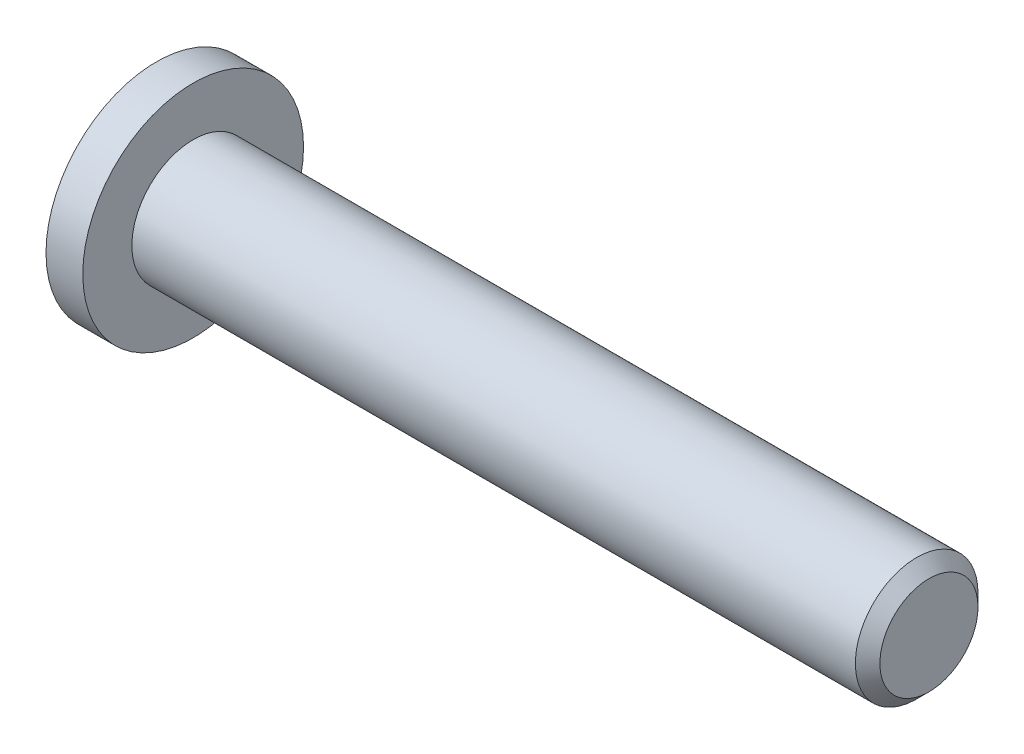
ISO-10303-21;
HEADER;
FILE_DESCRIPTION(('STEP AP214'),'2;1');
FILE_NAME('part.step','',(''),(''),'','','');
FILE_SCHEMA(('AUTOMOTIVE_DESIGN { 1 0 10303 214 1 1 1 1 }'));
ENDSEC;
DATA;
#1=APPLICATION_CONTEXT('core data for automotive mechanical design processes');
#2=APPLICATION_PROTOCOL_DEFINITION('international standard','automotive_design',2000,#1);
#3=PRODUCT_CONTEXT('',#1,'mechanical');
#4=PRODUCT('Part','Part','',(#3));
#5=PRODUCT_RELATED_PRODUCT_CATEGORY('part','',(#4));
#6=PRODUCT_DEFINITION_FORMATION('','',#4);
#7=PRODUCT_DEFINITION_CONTEXT('part definition',#1,'design');
#8=PRODUCT_DEFINITION('design','',#6,#7);
#9=PRODUCT_DEFINITION_SHAPE('','',#8);
#10=(LENGTH_UNIT() NAMED_UNIT(*) SI_UNIT(.MILLI.,.METRE.));
#11=(NAMED_UNIT(*) PLANE_ANGLE_UNIT() SI_UNIT($,.RADIAN.));
#12=(NAMED_UNIT(*) SI_UNIT($,.STERADIAN.) SOLID_ANGLE_UNIT());
#13=UNCERTAINTY_MEASURE_WITH_UNIT(LENGTH_MEASURE(1.E-05),#10,'distance_accuracy_value','');
#14=(GEOMETRIC_REPRESENTATION_CONTEXT(3) GLOBAL_UNCERTAINTY_ASSIGNED_CONTEXT((#13)) GLOBAL_UNIT_ASSIGNED_CONTEXT((#10,
#11,#12)) REPRESENTATION_CONTEXT('',''));
#15=CARTESIAN_POINT('',(0.,0.,0.));
#16=DIRECTION('',(0.,0.,1.));
#17=DIRECTION('',(1.,0.,0.));
#18=AXIS2_PLACEMENT_3D('',#15,#16,#17);
#19=CARTESIAN_POINT('',(1.5,0.,0.));
#20=DIRECTION('',(-1.,0.,0.));
#21=DIRECTION('',(0.,0.,1.));
#22=AXIS2_PLACEMENT_3D('',#19,#20,#21);
#23=CYLINDRICAL_SURFACE('',#22,4.5);
#24=CARTESIAN_POINT('',(1.5,0.,0.));
#25=DIRECTION('',(1.,0.,0.));
#26=DIRECTION('',(0.,0.,-1.));
#27=AXIS2_PLACEMENT_3D('',#24,#25,#26);
#28=CIRCLE('',#27,4.5);
#29=CARTESIAN_POINT('',(1.5,0.,-4.5));
#30=VERTEX_POINT('',#29);
#31=EDGE_CURVE('E151',#30,#30,#28,.T.);
#32=ORIENTED_EDGE('',*,*,#31,.F.);
#33=EDGE_LOOP('',(#32));
#34=FACE_BOUND('',#33,.T.);
#35=CARTESIAN_POINT('',(0.,0.,0.));
#36=DIRECTION('',(1.,0.,0.));
#37=DIRECTION('',(0.,0.,-1.));
#38=AXIS2_PLACEMENT_3D('',#35,#36,#37);
#39=CIRCLE('',#38,4.5);
#40=CARTESIAN_POINT('',(0.,0.,-4.5));
#41=VERTEX_POINT('',#40);
#42=EDGE_CURVE('E150',#41,#41,#39,.T.);
#43=ORIENTED_EDGE('',*,*,#42,.T.);
#44=EDGE_LOOP('',(#43));
#45=FACE_BOUND('',#44,.T.);
#46=ADVANCED_FACE('F40',(#34,#45),#23,.T.);
#47=CARTESIAN_POINT('',(1.5,0.,0.));
#48=DIRECTION('',(1.,0.,0.));
#49=DIRECTION('',(0.,0.,-1.));
#50=AXIS2_PLACEMENT_3D('',#47,#48,#49);
#51=PLANE('',#50);
#52=CARTESIAN_POINT('',(1.5,0.,0.));
#53=DIRECTION('',(1.,0.,0.));
#54=DIRECTION('',(0.,0.,-1.));
#55=AXIS2_PLACEMENT_3D('',#52,#53,#54);
#56=CIRCLE('',#55,2.5);
#57=CARTESIAN_POINT('',(1.5,0.,-2.5));
#58=VERTEX_POINT('',#57);
#59=EDGE_CURVE('E142',#58,#58,#56,.T.);
#60=ORIENTED_EDGE('',*,*,#59,.F.);
#61=EDGE_LOOP('',(#60));
#62=FACE_BOUND('',#61,.T.);
#63=ORIENTED_EDGE('',*,*,#31,.T.);
#64=EDGE_LOOP('',(#63));
#65=FACE_BOUND('',#64,.T.);
#66=ADVANCED_FACE('F169',(#62,#65),#51,.T.);
#67=CARTESIAN_POINT('',(0.,0.,0.));
#68=DIRECTION('',(1.,0.,0.));
#69=DIRECTION('',(0.,0.,-1.));
#70=AXIS2_PLACEMENT_3D('',#67,#68,#69);
#71=PLANE('',#70);
#72=DIRECTION('',(0.,-0.500000000000001,-0.866025403784439));
#73=VECTOR('',#72,1.);
#74=CARTESIAN_POINT('',(0.,1.73205080756887,0.));
#75=LINE('',#74,#73);
#76=CARTESIAN_POINT('',(0.,1.73205080756887,0.));
#77=VERTEX_POINT('',#76);
#78=CARTESIAN_POINT('',(0.,0.866025403784415,-1.49999999999999));
#79=VERTEX_POINT('',#78);
#80=EDGE_CURVE('E129',#77,#79,#75,.T.);
#81=ORIENTED_EDGE('',*,*,#80,.F.);
#82=DIRECTION('',(0.,0.5,-0.866025403784438));
#83=VECTOR('',#82,1.);
#84=CARTESIAN_POINT('',(0.,0.866025403784429,1.50000000000001));
#85=LINE('',#84,#83);
#86=CARTESIAN_POINT('',(0.,0.866025403784429,1.50000000000001));
#87=VERTEX_POINT('',#86);
#88=EDGE_CURVE('E55',#87,#77,#85,.T.);
#89=ORIENTED_EDGE('',*,*,#88,.F.);
#90=DIRECTION('',(0.,1.,0.));
#91=VECTOR('',#90,1.);
#92=CARTESIAN_POINT('',(0.,-0.866025403784457,1.5));
#93=LINE('',#92,#91);
#94=CARTESIAN_POINT('',(0.,-0.866025403784457,1.5));
#95=VERTEX_POINT('',#94);
#96=EDGE_CURVE('E138',#95,#87,#93,.T.);
#97=ORIENTED_EDGE('',*,*,#96,.F.);
#98=DIRECTION('',(0.,0.500000000000001,0.866025403784439));
#99=VECTOR('',#98,1.);
#100=CARTESIAN_POINT('',(0.,-1.73205080756891,0.));
#101=LINE('',#100,#99);
#102=CARTESIAN_POINT('',(0.,-1.73205080756891,0.));
#103=VERTEX_POINT('',#102);
#104=EDGE_CURVE('E136',#103,#95,#101,.T.);
#105=ORIENTED_EDGE('',*,*,#104,.F.);
#106=DIRECTION('',(0.,-0.500000000000001,0.866025403784438));
#107=VECTOR('',#106,1.);
#108=CARTESIAN_POINT('',(0.,-0.866025403784443,-1.49999999999999));
#109=LINE('',#108,#107);
#110=CARTESIAN_POINT('',(0.,-0.866025403784443,-1.49999999999999));
#111=VERTEX_POINT('',#110);
#112=EDGE_CURVE('E103',#111,#103,#109,.T.);
#113=ORIENTED_EDGE('',*,*,#112,.F.);
#114=DIRECTION('',(0.,-1.,0.));
#115=VECTOR('',#114,1.);
#116=CARTESIAN_POINT('',(0.,0.866025403784415,-1.49999999999999));
#117=LINE('',#116,#115);
#118=EDGE_CURVE('E132',#79,#111,#117,.T.);
#119=ORIENTED_EDGE('',*,*,#118,.F.);
#120=EDGE_LOOP('',(#81,#89,#97,#105,#113,#119));
#121=FACE_BOUND('',#120,.T.);
#122=ORIENTED_EDGE('',*,*,#42,.F.);
#123=EDGE_LOOP('',(#122));
#124=FACE_BOUND('',#123,.T.);
#125=ADVANCED_FACE('F174',(#121,#124),#71,.F.);
#126=CARTESIAN_POINT('',(31.5,0.,0.));
#127=DIRECTION('',(-1.,0.,0.));
#128=DIRECTION('',(0.,0.,1.));
#129=AXIS2_PLACEMENT_3D('',#126,#127,#128);
#130=CYLINDRICAL_SURFACE('',#129,2.5);
#131=CARTESIAN_POINT('',(31.,0.,0.));
#132=DIRECTION('',(1.,0.,0.));
#133=DIRECTION('',(0.,0.,-1.));
#134=AXIS2_PLACEMENT_3D('',#131,#132,#133);
#135=CIRCLE('',#134,2.5);
#136=CARTESIAN_POINT('',(31.,0.,-2.50000000000001));
#137=VERTEX_POINT('',#136);
#138=EDGE_CURVE('E11',#137,#137,#135,.F.);
#139=ORIENTED_EDGE('',*,*,#138,.T.);
#140=EDGE_LOOP('',(#139));
#141=FACE_BOUND('',#140,.T.);
#142=ORIENTED_EDGE('',*,*,#59,.T.);
#143=EDGE_LOOP('',(#142));
#144=FACE_BOUND('',#143,.T.);
#145=ADVANCED_FACE('F181',(#141,#144),#130,.T.);
#146=CARTESIAN_POINT('',(31.5,0.,0.));
#147=DIRECTION('',(1.,0.,0.));
#148=DIRECTION('',(0.,0.,-1.));
#149=AXIS2_PLACEMENT_3D('',#146,#147,#148);
#150=PLANE('',#149);
#151=CARTESIAN_POINT('',(31.5,0.,0.));
#152=DIRECTION('',(1.,0.,0.));
#153=DIRECTION('',(0.,0.,-1.));
#154=AXIS2_PLACEMENT_3D('',#151,#152,#153);
#155=CIRCLE('',#154,2.);
#156=CARTESIAN_POINT('',(31.5,0.,-2.00000000000001));
#157=VERTEX_POINT('',#156);
#158=EDGE_CURVE('E48',#157,#157,#155,.T.);
#159=ORIENTED_EDGE('',*,*,#158,.T.);
#160=EDGE_LOOP('',(#159));
#161=FACE_BOUND('',#160,.T.);
#162=ADVANCED_FACE('F158',(#161),#150,.T.);
#163=CARTESIAN_POINT('',(3.,0.866025403784429,1.50000000000002));
#164=DIRECTION('',(0.,0.866025403784441,0.5));
#165=DIRECTION('',(0.,-0.5,0.866025403784439));
#166=AXIS2_PLACEMENT_3D('',#163,#164,#165);
#167=PLANE('',#166);
#168=ORIENTED_EDGE('',*,*,#88,.T.);
#169=DIRECTION('',(-1.,0.,0.));
#170=VECTOR('',#169,1.);
#171=CARTESIAN_POINT('',(3.,1.73205080756887,0.));
#172=LINE('',#171,#170);
#173=CARTESIAN_POINT('',(3.,1.73205080756887,0.));
#174=VERTEX_POINT('',#173);
#175=EDGE_CURVE('E85',#174,#77,#172,.T.);
#176=ORIENTED_EDGE('',*,*,#175,.F.);
#177=DIRECTION('',(0.,0.5,-0.866025403784438));
#178=VECTOR('',#177,1.);
#179=CARTESIAN_POINT('',(3.,0.866025403784429,1.50000000000002));
#180=LINE('',#179,#178);
#181=CARTESIAN_POINT('',(3.,0.866025403784429,1.50000000000002));
#182=VERTEX_POINT('',#181);
#183=EDGE_CURVE('E140',#182,#174,#180,.T.);
#184=ORIENTED_EDGE('',*,*,#183,.F.);
#185=DIRECTION('',(-1.,0.,0.));
#186=VECTOR('',#185,1.);
#187=CARTESIAN_POINT('',(3.,0.866025403784429,1.50000000000002));
#188=LINE('',#187,#186);
#189=EDGE_CURVE('E63',#182,#87,#188,.T.);
#190=ORIENTED_EDGE('',*,*,#189,.T.);
#191=EDGE_LOOP('',(#168,#176,#184,#190));
#192=FACE_BOUND('',#191,.T.);
#193=ADVANCED_FACE('F189',(#192),#167,.F.);
#194=CARTESIAN_POINT('',(3.,-0.866025403784457,1.5));
#195=DIRECTION('',(0.,0.,1.));
#196=DIRECTION('',(0.,-1.,0.));
#197=AXIS2_PLACEMENT_3D('',#194,#195,#196);
#198=PLANE('',#197);
#199=ORIENTED_EDGE('',*,*,#96,.T.);
#200=ORIENTED_EDGE('',*,*,#189,.F.);
#201=DIRECTION('',(0.,1.,0.));
#202=VECTOR('',#201,1.);
#203=CARTESIAN_POINT('',(3.,-0.866025403784457,1.5));
#204=LINE('',#203,#202);
#205=CARTESIAN_POINT('',(3.,-0.866025403784457,1.5));
#206=VERTEX_POINT('',#205);
#207=EDGE_CURVE('E115',#206,#182,#204,.T.);
#208=ORIENTED_EDGE('',*,*,#207,.F.);
#209=DIRECTION('',(-1.,0.,0.));
#210=VECTOR('',#209,1.);
#211=CARTESIAN_POINT('',(3.,-0.866025403784457,1.5));
#212=LINE('',#211,#210);
#213=EDGE_CURVE('E107',#206,#95,#212,.T.);
#214=ORIENTED_EDGE('',*,*,#213,.T.);
#215=EDGE_LOOP('',(#199,#200,#208,#214));
#216=FACE_BOUND('',#215,.T.);
#217=ADVANCED_FACE('F192',(#216),#198,.F.);
#218=CARTESIAN_POINT('',(3.,-1.73205080756891,0.));
#219=DIRECTION('',(0.,-0.86602540378444,0.5));
#220=DIRECTION('',(0.,-0.500000000000001,-0.866025403784439));
#221=AXIS2_PLACEMENT_3D('',#218,#219,#220);
#222=PLANE('',#221);
#223=ORIENTED_EDGE('',*,*,#104,.T.);
#224=ORIENTED_EDGE('',*,*,#213,.F.);
#225=DIRECTION('',(0.,0.500000000000001,0.866025403784439));
#226=VECTOR('',#225,1.);
#227=CARTESIAN_POINT('',(3.,-1.73205080756891,0.));
#228=LINE('',#227,#226);
#229=CARTESIAN_POINT('',(3.,-1.73205080756891,0.));
#230=VERTEX_POINT('',#229);
#231=EDGE_CURVE('E111',#230,#206,#228,.T.);
#232=ORIENTED_EDGE('',*,*,#231,.F.);
#233=DIRECTION('',(-1.,0.,0.));
#234=VECTOR('',#233,1.);
#235=CARTESIAN_POINT('',(3.,-1.73205080756891,0.));
#236=LINE('',#235,#234);
#237=EDGE_CURVE('E96',#230,#103,#236,.T.);
#238=ORIENTED_EDGE('',*,*,#237,.T.);
#239=EDGE_LOOP('',(#223,#224,#232,#238));
#240=FACE_BOUND('',#239,.T.);
#241=ADVANCED_FACE('F112',(#240),#222,.F.);
#242=CARTESIAN_POINT('',(3.,-0.866025403784443,-1.50000000000001));
#243=DIRECTION('',(0.,-0.86602540378444,-0.500000000000001));
#244=DIRECTION('',(0.,0.500000000000001,-0.866025403784438));
#245=AXIS2_PLACEMENT_3D('',#242,#243,#244);
#246=PLANE('',#245);
#247=ORIENTED_EDGE('',*,*,#112,.T.);
#248=ORIENTED_EDGE('',*,*,#237,.F.);
#249=DIRECTION('',(0.,-0.500000000000001,0.866025403784438));
#250=VECTOR('',#249,1.);
#251=CARTESIAN_POINT('',(3.,-0.866025403784443,-1.50000000000001));
#252=LINE('',#251,#250);
#253=CARTESIAN_POINT('',(3.,-0.866025403784443,-1.50000000000001));
#254=VERTEX_POINT('',#253);
#255=EDGE_CURVE('E100',#254,#230,#252,.T.);
#256=ORIENTED_EDGE('',*,*,#255,.F.);
#257=DIRECTION('',(-1.,0.,0.));
#258=VECTOR('',#257,1.);
#259=CARTESIAN_POINT('',(3.,-0.866025403784443,-1.50000000000001));
#260=LINE('',#259,#258);
#261=EDGE_CURVE('E108',#254,#111,#260,.T.);
#262=ORIENTED_EDGE('',*,*,#261,.T.);
#263=EDGE_LOOP('',(#247,#248,#256,#262));
#264=FACE_BOUND('',#263,.T.);
#265=ADVANCED_FACE('F98',(#264),#246,.F.);
#266=CARTESIAN_POINT('',(3.,0.866025403784401,-1.49999999999998));
#267=DIRECTION('',(0.,0.,-1.));
#268=DIRECTION('',(-1.,0.,0.));
#269=AXIS2_PLACEMENT_3D('',#266,#267,#268);
#270=PLANE('',#269);
#271=ORIENTED_EDGE('',*,*,#118,.T.);
#272=ORIENTED_EDGE('',*,*,#261,.F.);
#273=DIRECTION('',(0.,-1.,0.));
#274=VECTOR('',#273,1.);
#275=CARTESIAN_POINT('',(3.,0.866025403784401,-1.49999999999998));
#276=LINE('',#275,#274);
#277=CARTESIAN_POINT('',(3.,0.866025403784401,-1.49999999999998));
#278=VERTEX_POINT('',#277);
#279=EDGE_CURVE('E121',#278,#254,#276,.T.);
#280=ORIENTED_EDGE('',*,*,#279,.F.);
#281=DIRECTION('',(-1.,0.,0.));
#282=VECTOR('',#281,1.);
#283=CARTESIAN_POINT('',(3.,0.866025403784401,-1.49999999999998));
#284=LINE('',#283,#282);
#285=EDGE_CURVE('E145',#278,#79,#284,.T.);
#286=ORIENTED_EDGE('',*,*,#285,.T.);
#287=EDGE_LOOP('',(#271,#272,#280,#286));
#288=FACE_BOUND('',#287,.T.);
#289=ADVANCED_FACE('F195',(#288),#270,.F.);
#290=CARTESIAN_POINT('',(3.,1.73205080756887,0.));
#291=DIRECTION('',(0.,0.86602540378444,-0.5));
#292=DIRECTION('',(0.,0.500000000000001,0.866025403784439));
#293=AXIS2_PLACEMENT_3D('',#290,#291,#292);
#294=PLANE('',#293);
#295=ORIENTED_EDGE('',*,*,#80,.T.);
#296=ORIENTED_EDGE('',*,*,#285,.F.);
#297=DIRECTION('',(0.,-0.500000000000001,-0.866025403784439));
#298=VECTOR('',#297,1.);
#299=CARTESIAN_POINT('',(3.,1.73205080756887,0.));
#300=LINE('',#299,#298);
#301=EDGE_CURVE('E123',#174,#278,#300,.T.);
#302=ORIENTED_EDGE('',*,*,#301,.F.);
#303=ORIENTED_EDGE('',*,*,#175,.T.);
#304=EDGE_LOOP('',(#295,#296,#302,#303));
#305=FACE_BOUND('',#304,.T.);
#306=ADVANCED_FACE('F165',(#305),#294,.F.);
#307=CARTESIAN_POINT('',(3.,0.,0.));
#308=DIRECTION('',(-1.,0.,0.));
#309=DIRECTION('',(0.,0.,1.));
#310=AXIS2_PLACEMENT_3D('',#307,#308,#309);
#311=PLANE('',#310);
#312=ORIENTED_EDGE('',*,*,#183,.T.);
#313=ORIENTED_EDGE('',*,*,#301,.T.);
#314=ORIENTED_EDGE('',*,*,#279,.T.);
#315=ORIENTED_EDGE('',*,*,#255,.T.);
#316=ORIENTED_EDGE('',*,*,#231,.T.);
#317=ORIENTED_EDGE('',*,*,#207,.T.);
#318=EDGE_LOOP('',(#312,#313,#314,#315,#316,#317));
#319=FACE_BOUND('',#318,.T.);
#320=ADVANCED_FACE('F118',(#319),#311,.T.);
#321=CARTESIAN_POINT('',(31.5,0.,0.));
#322=DIRECTION('',(-1.,0.,0.));
#323=DIRECTION('',(0.,0.,1.));
#324=AXIS2_PLACEMENT_3D('',#321,#322,#323);
#325=CONICAL_SURFACE('',#324,2.,0.785398163397443);
#326=ORIENTED_EDGE('',*,*,#138,.F.);
#327=EDGE_LOOP('',(#326));
#328=FACE_BOUND('',#327,.T.);
#329=ORIENTED_EDGE('',*,*,#158,.F.);
#330=EDGE_LOOP('',(#329));
#331=FACE_BOUND('',#330,.T.);
#332=ADVANCED_FACE('F42',(#328,#331),#325,.T.);
#333=CLOSED_SHELL('',(#46,#66,#125,#145,#162,#193,#217,#241,#265,#289,#306,#320,#332));
#334=MANIFOLD_SOLID_BREP('B2',#333);
#335=ADVANCED_BREP_SHAPE_REPRESENTATION('',(#18,#334),#14);
#336=SHAPE_DEFINITION_REPRESENTATION(#9,#335);
ENDSEC;
END-ISO-10303-21;
